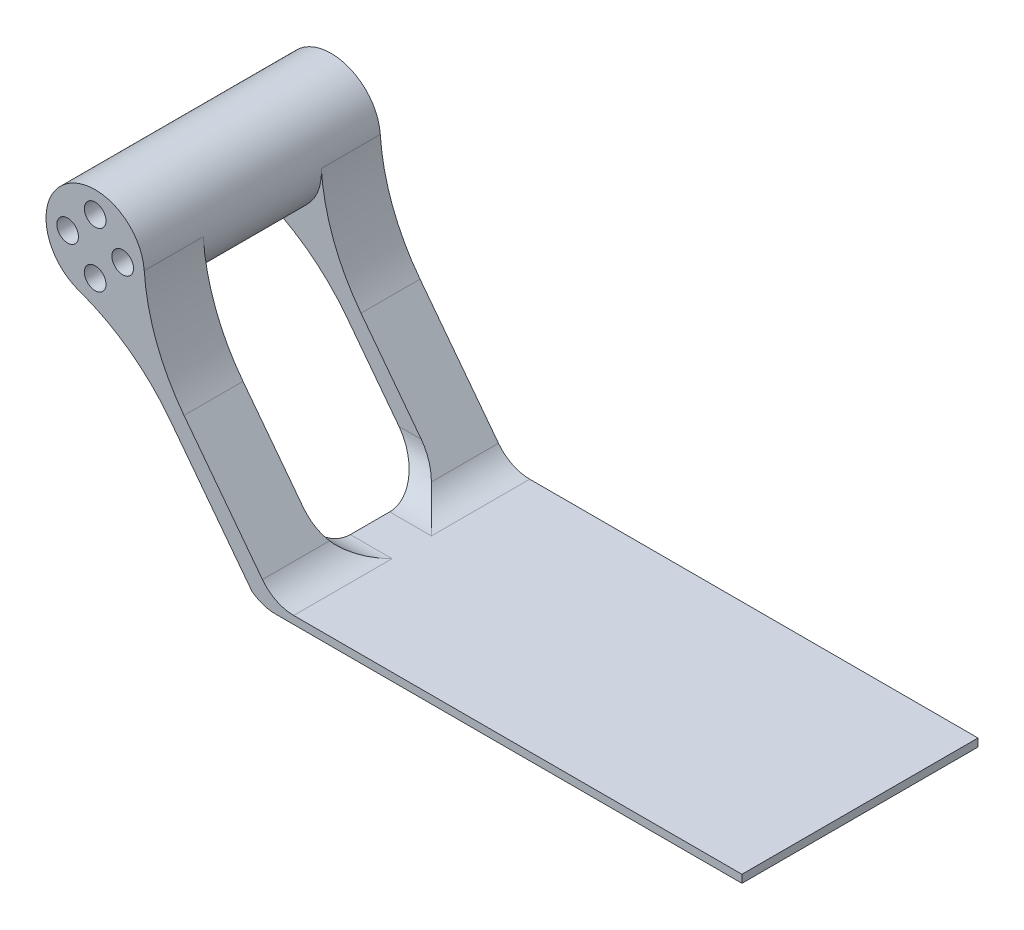
ISO-10303-21;
HEADER;
FILE_DESCRIPTION(('STEP AP214'),'2;1');
FILE_NAME('part.step','',(''),(''),'','','');
FILE_SCHEMA(('AUTOMOTIVE_DESIGN { 1 0 10303 214 1 1 1 1 }'));
ENDSEC;
DATA;
#1=APPLICATION_CONTEXT('core data for automotive mechanical design processes');
#2=APPLICATION_PROTOCOL_DEFINITION('international standard','automotive_design',2000,#1);
#3=PRODUCT_CONTEXT('',#1,'mechanical');
#4=PRODUCT('Part','Part','',(#3));
#5=PRODUCT_RELATED_PRODUCT_CATEGORY('part','',(#4));
#6=PRODUCT_DEFINITION_FORMATION('','',#4);
#7=PRODUCT_DEFINITION_CONTEXT('part definition',#1,'design');
#8=PRODUCT_DEFINITION('design','',#6,#7);
#9=PRODUCT_DEFINITION_SHAPE('','',#8);
#10=(LENGTH_UNIT() NAMED_UNIT(*) SI_UNIT(.MILLI.,.METRE.));
#11=(NAMED_UNIT(*) PLANE_ANGLE_UNIT() SI_UNIT($,.RADIAN.));
#12=(NAMED_UNIT(*) SI_UNIT($,.STERADIAN.) SOLID_ANGLE_UNIT());
#13=UNCERTAINTY_MEASURE_WITH_UNIT(LENGTH_MEASURE(1.E-05),#10,'distance_accuracy_value','');
#14=(GEOMETRIC_REPRESENTATION_CONTEXT(3) GLOBAL_UNCERTAINTY_ASSIGNED_CONTEXT((#13)) GLOBAL_UNIT_ASSIGNED_CONTEXT((#10,
#11,#12)) REPRESENTATION_CONTEXT('',''));
#15=CARTESIAN_POINT('',(0.,0.,0.));
#16=DIRECTION('',(0.,0.,1.));
#17=DIRECTION('',(1.,0.,0.));
#18=AXIS2_PLACEMENT_3D('',#15,#16,#17);
#19=CARTESIAN_POINT('',(0.,0.,-19.));
#20=DIRECTION('',(0.,0.,-1.));
#21=DIRECTION('',(1.,0.,0.));
#22=AXIS2_PLACEMENT_3D('',#19,#20,#21);
#23=PLANE('',#22);
#24=CARTESIAN_POINT('',(-110.53749201089,58.0105942458387,-19.));
#25=DIRECTION('',(0.,0.,1.));
#26=DIRECTION('',(1.,0.,0.));
#27=AXIS2_PLACEMENT_3D('',#24,#25,#26);
#28=CIRCLE('',#27,12.5);
#29=CARTESIAN_POINT('',(-114.691586328743,46.2210437710164,-19.));
#30=VERTEX_POINT('',#29);
#31=CARTESIAN_POINT('',(-98.0684013190819,58.8891028226064,-19.));
#32=VERTEX_POINT('',#31);
#33=EDGE_CURVE('E253',#30,#32,#28,.T.);
#34=ORIENTED_EDGE('',*,*,#33,.F.);
#35=CARTESIAN_POINT('',(-131.307963600154,-0.937158128272934,-19.));
#36=DIRECTION('',(0.,0.,-1.));
#37=DIRECTION('',(-1.,0.,0.));
#38=AXIS2_PLACEMENT_3D('',#35,#36,#37);
#39=CIRCLE('',#38,50.);
#40=CARTESIAN_POINT('',(-91.539578409577,29.3692032391673,-19.));
#41=VERTEX_POINT('',#40);
#42=EDGE_CURVE('E280',#30,#41,#39,.T.);
#43=ORIENTED_EDGE('',*,*,#42,.T.);
#44=DIRECTION('',(-0.606127227348806,0.795367703811545,0.));
#45=VECTOR('',#44,1.);
#46=CARTESIAN_POINT('',(-43.750115665387,-33.340725525277,-19.));
#47=LINE('',#46,#45);
#48=CARTESIAN_POINT('',(-78.3029999689858,12.,-19.));
#49=VERTEX_POINT('',#48);
#50=EDGE_CURVE('E360',#49,#41,#47,.T.);
#51=ORIENTED_EDGE('',*,*,#50,.F.);
#52=DIRECTION('',(-1.,0.,0.));
#53=VECTOR('',#52,1.);
#54=CARTESIAN_POINT('',(-65.0245223254047,12.,-19.));
#55=LINE('',#54,#53);
#56=CARTESIAN_POINT('',(-72.6452394408236,12.,-19.));
#57=VERTEX_POINT('',#56);
#58=EDGE_CURVE('E235',#49,#57,#55,.F.);
#59=ORIENTED_EDGE('',*,*,#58,.T.);
#60=DIRECTION('',(0.606127227348806,-0.795367703811545,0.));
#61=VECTOR('',#60,1.);
#62=CARTESIAN_POINT('',(-40.170960998235,-30.6131530022074,-19.));
#63=LINE('',#62,#61);
#64=CARTESIAN_POINT('',(-87.9604237424251,32.0967757622371,-19.));
#65=VERTEX_POINT('',#64);
#66=EDGE_CURVE('E362',#65,#57,#63,.T.);
#67=ORIENTED_EDGE('',*,*,#66,.F.);
#68=CARTESIAN_POINT('',(-48.1920385518479,62.4031371296773,-19.));
#69=DIRECTION('',(0.,0.,-1.));
#70=DIRECTION('',(-1.,0.,0.));
#71=AXIS2_PLACEMENT_3D('',#68,#69,#70);
#72=CIRCLE('',#71,50.);
#73=EDGE_CURVE('E284',#65,#32,#72,.T.);
#74=ORIENTED_EDGE('',*,*,#73,.T.);
#75=EDGE_LOOP('',(#34,#43,#51,#59,#67,#74));
#76=FACE_BOUND('',#75,.T.);
#77=ADVANCED_FACE('F40',(#76),#23,.F.);
#78=CARTESIAN_POINT('',(0.,0.,11.));
#79=DIRECTION('',(0.,0.,1.));
#80=DIRECTION('',(1.,0.,0.));
#81=AXIS2_PLACEMENT_3D('',#78,#79,#80);
#82=PLANE('',#81);
#83=CARTESIAN_POINT('',(-110.53749201089,58.0105942458387,11.));
#84=DIRECTION('',(0.,0.,-1.));
#85=DIRECTION('',(-1.,0.,0.));
#86=AXIS2_PLACEMENT_3D('',#83,#84,#85);
#87=CIRCLE('',#86,12.5);
#88=CARTESIAN_POINT('',(-98.0684013190819,58.8891028226064,11.));
#89=VERTEX_POINT('',#88);
#90=CARTESIAN_POINT('',(-114.691586328743,46.2210437710164,11.));
#91=VERTEX_POINT('',#90);
#92=EDGE_CURVE('E230',#89,#91,#87,.T.);
#93=ORIENTED_EDGE('',*,*,#92,.F.);
#94=CARTESIAN_POINT('',(-48.1920385518479,62.4031371296773,11.));
#95=DIRECTION('',(0.,0.,1.));
#96=DIRECTION('',(1.,0.,0.));
#97=AXIS2_PLACEMENT_3D('',#94,#95,#96);
#98=CIRCLE('',#97,50.);
#99=CARTESIAN_POINT('',(-87.9604237424251,32.0967757622371,11.));
#100=VERTEX_POINT('',#99);
#101=EDGE_CURVE('E11',#89,#100,#98,.T.);
#102=ORIENTED_EDGE('',*,*,#101,.T.);
#103=DIRECTION('',(0.606127227348806,-0.795367703811545,0.));
#104=VECTOR('',#103,1.);
#105=CARTESIAN_POINT('',(-40.170960998235,-30.6131530022074,11.));
#106=LINE('',#105,#104);
#107=CARTESIAN_POINT('',(-72.6452394408236,12.,11.));
#108=VERTEX_POINT('',#107);
#109=EDGE_CURVE('E295',#100,#108,#106,.T.);
#110=ORIENTED_EDGE('',*,*,#109,.T.);
#111=DIRECTION('',(-1.,0.,0.));
#112=VECTOR('',#111,1.);
#113=CARTESIAN_POINT('',(-70.682282853567,12.,11.));
#114=LINE('',#113,#112);
#115=CARTESIAN_POINT('',(-78.3029999689858,12.,11.));
#116=VERTEX_POINT('',#115);
#117=EDGE_CURVE('E209',#108,#116,#114,.T.);
#118=ORIENTED_EDGE('',*,*,#117,.T.);
#119=DIRECTION('',(-0.606127227348806,0.795367703811545,0.));
#120=VECTOR('',#119,1.);
#121=CARTESIAN_POINT('',(-43.750115665387,-33.340725525277,11.));
#122=LINE('',#121,#120);
#123=CARTESIAN_POINT('',(-91.539578409577,29.3692032391673,11.));
#124=VERTEX_POINT('',#123);
#125=EDGE_CURVE('E182',#116,#124,#122,.T.);
#126=ORIENTED_EDGE('',*,*,#125,.T.);
#127=CARTESIAN_POINT('',(-131.307963600154,-0.937158128272934,11.));
#128=DIRECTION('',(0.,0.,1.));
#129=DIRECTION('',(1.,0.,0.));
#130=AXIS2_PLACEMENT_3D('',#127,#128,#129);
#131=CIRCLE('',#130,50.);
#132=EDGE_CURVE('E275',#124,#91,#131,.T.);
#133=ORIENTED_EDGE('',*,*,#132,.T.);
#134=EDGE_LOOP('',(#93,#102,#110,#118,#126,#133));
#135=FACE_BOUND('',#134,.T.);
#136=ADVANCED_FACE('F356',(#135),#82,.F.);
#137=CARTESIAN_POINT('',(0.,2.,0.));
#138=DIRECTION('',(0.,-1.,0.));
#139=DIRECTION('',(0.,0.,-1.));
#140=AXIS2_PLACEMENT_3D('',#137,#138,#139);
#141=PLANE('',#140);
#142=DIRECTION('',(0.,0.,-1.));
#143=VECTOR('',#142,1.);
#144=CARTESIAN_POINT('',(-60.0724382671297,2.,0.));
#145=LINE('',#144,#143);
#146=CARTESIAN_POINT('',(-60.0724382671297,2.,-34.));
#147=VERTEX_POINT('',#146);
#148=CARTESIAN_POINT('',(-60.0724382671297,2.,-9.00000000000002));
#149=VERTEX_POINT('',#148);
#150=EDGE_CURVE('E225',#147,#149,#145,.F.);
#151=ORIENTED_EDGE('',*,*,#150,.T.);
#152=DIRECTION('',(-1.,0.,0.));
#153=VECTOR('',#152,1.);
#154=CARTESIAN_POINT('',(-70.682282853567,2.,-9.00000000000002));
#155=LINE('',#154,#153);
#156=CARTESIAN_POINT('',(-70.682282853567,2.,-9.00000000000002));
#157=VERTEX_POINT('',#156);
#158=EDGE_CURVE('E232',#149,#157,#155,.T.);
#159=ORIENTED_EDGE('',*,*,#158,.T.);
#160=DIRECTION('',(0.,0.,1.));
#161=VECTOR('',#160,1.);
#162=CARTESIAN_POINT('',(-70.682282853567,2.,8.52060075093872));
#163=LINE('',#162,#161);
#164=CARTESIAN_POINT('',(-70.682282853567,2.,0.999999999999989));
#165=VERTEX_POINT('',#164);
#166=EDGE_CURVE('E319',#157,#165,#163,.T.);
#167=ORIENTED_EDGE('',*,*,#166,.T.);
#168=DIRECTION('',(-1.,0.,0.));
#169=VECTOR('',#168,1.);
#170=CARTESIAN_POINT('',(-65.0245223254047,2.,0.999999999999989));
#171=LINE('',#170,#169);
#172=CARTESIAN_POINT('',(-60.0724382671297,2.,0.999999999999989));
#173=VERTEX_POINT('',#172);
#174=EDGE_CURVE('E214',#165,#173,#171,.F.);
#175=ORIENTED_EDGE('',*,*,#174,.T.);
#176=DIRECTION('',(0.,0.,1.));
#177=VECTOR('',#176,1.);
#178=CARTESIAN_POINT('',(-60.0724382671297,2.,26.));
#179=LINE('',#178,#177);
#180=CARTESIAN_POINT('',(-60.0724382671297,2.,26.));
#181=VERTEX_POINT('',#180);
#182=EDGE_CURVE('E212',#173,#181,#179,.T.);
#183=ORIENTED_EDGE('',*,*,#182,.T.);
#184=DIRECTION('',(1.,0.,0.));
#185=VECTOR('',#184,1.);
#186=CARTESIAN_POINT('',(53.8677171464331,2.,26.));
#187=LINE('',#186,#185);
#188=CARTESIAN_POINT('',(53.8677171464331,2.,26.));
#189=VERTEX_POINT('',#188);
#190=EDGE_CURVE('E318',#181,#189,#187,.T.);
#191=ORIENTED_EDGE('',*,*,#190,.T.);
#192=DIRECTION('',(0.,0.,-1.));
#193=VECTOR('',#192,1.);
#194=CARTESIAN_POINT('',(53.867717146433,2.,-34.));
#195=LINE('',#194,#193);
#196=CARTESIAN_POINT('',(53.867717146433,2.,-34.));
#197=VERTEX_POINT('',#196);
#198=EDGE_CURVE('E321',#189,#197,#195,.T.);
#199=ORIENTED_EDGE('',*,*,#198,.T.);
#200=DIRECTION('',(-1.,0.,0.));
#201=VECTOR('',#200,1.);
#202=CARTESIAN_POINT('',(-70.6822828535669,2.,-34.));
#203=LINE('',#202,#201);
#204=EDGE_CURVE('E323',#197,#147,#203,.T.);
#205=ORIENTED_EDGE('',*,*,#204,.T.);
#206=EDGE_LOOP('',(#151,#159,#167,#175,#183,#191,#199,#205));
#207=FACE_BOUND('',#206,.T.);
#208=ADVANCED_FACE('F346',(#207),#141,.F.);
#209=CARTESIAN_POINT('',(53.8677171464331,2.,26.));
#210=DIRECTION('',(0.,0.,-1.));
#211=DIRECTION('',(-1.,0.,0.));
#212=AXIS2_PLACEMENT_3D('',#209,#210,#211);
#213=PLANE('',#212);
#214=ORIENTED_EDGE('',*,*,#190,.F.);
#215=CARTESIAN_POINT('',(-60.0724382671297,12.,26.));
#216=DIRECTION('',(0.,0.,-1.));
#217=DIRECTION('',(-1.,0.,0.));
#218=AXIS2_PLACEMENT_3D('',#215,#216,#217);
#219=CIRCLE('',#218,10.);
#220=CARTESIAN_POINT('',(-68.0261153052451,5.93872772651194,26.));
#221=VERTEX_POINT('',#220);
#222=EDGE_CURVE('E222',#181,#221,#219,.T.);
#223=ORIENTED_EDGE('',*,*,#222,.T.);
#224=DIRECTION('',(0.606127227348806,-0.795367703811545,0.));
#225=VECTOR('',#224,1.);
#226=CARTESIAN_POINT('',(-40.170960998235,-30.6131530022074,26.));
#227=LINE('',#226,#225);
#228=CARTESIAN_POINT('',(-87.9604237424251,32.0967757622371,26.));
#229=VERTEX_POINT('',#228);
#230=EDGE_CURVE('E229',#229,#221,#227,.T.);
#231=ORIENTED_EDGE('',*,*,#230,.F.);
#232=CARTESIAN_POINT('',(-48.1920385518479,62.4031371296773,26.));
#233=DIRECTION('',(0.,0.,-1.));
#234=DIRECTION('',(-1.,0.,0.));
#235=AXIS2_PLACEMENT_3D('',#232,#233,#234);
#236=CIRCLE('',#235,50.);
#237=CARTESIAN_POINT('',(-98.0684013190819,58.8891028226064,26.));
#238=VERTEX_POINT('',#237);
#239=EDGE_CURVE('E48',#229,#238,#236,.T.);
#240=ORIENTED_EDGE('',*,*,#239,.T.);
#241=CARTESIAN_POINT('',(-110.53749201089,58.0105942458387,26.));
#242=DIRECTION('',(0.,0.,1.));
#243=DIRECTION('',(1.,0.,0.));
#244=AXIS2_PLACEMENT_3D('',#241,#242,#243);
#245=CIRCLE('',#244,12.5);
#246=CARTESIAN_POINT('',(-114.691586328743,46.2210437710164,26.));
#247=VERTEX_POINT('',#246);
#248=EDGE_CURVE('E193',#238,#247,#245,.T.);
#249=ORIENTED_EDGE('',*,*,#248,.T.);
#250=CARTESIAN_POINT('',(-131.307963600154,-0.937158128272934,26.));
#251=DIRECTION('',(0.,0.,-1.));
#252=DIRECTION('',(-1.,0.,0.));
#253=AXIS2_PLACEMENT_3D('',#250,#251,#252);
#254=CIRCLE('',#253,50.);
#255=CARTESIAN_POINT('',(-91.539578409577,29.3692032391673,26.));
#256=VERTEX_POINT('',#255);
#257=EDGE_CURVE('E191',#247,#256,#254,.T.);
#258=ORIENTED_EDGE('',*,*,#257,.T.);
#259=DIRECTION('',(-0.606127227348806,0.795367703811545,0.));
#260=VECTOR('',#259,1.);
#261=CARTESIAN_POINT('',(-43.750115665387,-33.340725525277,26.));
#262=LINE('',#261,#260);
#263=CARTESIAN_POINT('',(-70.682282853567,1.99999999999998,26.));
#264=VERTEX_POINT('',#263);
#265=EDGE_CURVE('E173',#264,#256,#262,.T.);
#266=ORIENTED_EDGE('',*,*,#265,.F.);
#267=CARTESIAN_POINT('',(-64.682282853567,10.,26.));
#268=DIRECTION('',(0.,0.,-1.));
#269=DIRECTION('',(-1.,0.,0.));
#270=AXIS2_PLACEMENT_3D('',#267,#268,#269);
#271=CIRCLE('',#270,10.);
#272=CARTESIAN_POINT('',(-64.682282853567,0.,26.));
#273=VERTEX_POINT('',#272);
#274=EDGE_CURVE('E188',#264,#273,#271,.F.);
#275=ORIENTED_EDGE('',*,*,#274,.T.);
#276=DIRECTION('',(1.,0.,0.));
#277=VECTOR('',#276,1.);
#278=CARTESIAN_POINT('',(53.8677171464331,0.,26.));
#279=LINE('',#278,#277);
#280=CARTESIAN_POINT('',(53.8677171464331,0.,26.));
#281=VERTEX_POINT('',#280);
#282=EDGE_CURVE('E181',#273,#281,#279,.T.);
#283=ORIENTED_EDGE('',*,*,#282,.T.);
#284=DIRECTION('',(0.,-1.,0.));
#285=VECTOR('',#284,1.);
#286=CARTESIAN_POINT('',(53.8677171464331,2.,26.));
#287=LINE('',#286,#285);
#288=EDGE_CURVE('E199',#189,#281,#287,.T.);
#289=ORIENTED_EDGE('',*,*,#288,.F.);
#290=EDGE_LOOP('',(#214,#223,#231,#240,#249,#258,#266,#275,#283,#289));
#291=FACE_BOUND('',#290,.T.);
#292=CARTESIAN_POINT('',(-117.53749201089,58.0105942458386,26.));
#293=DIRECTION('',(0.,0.,1.));
#294=DIRECTION('',(1.,0.,0.));
#295=AXIS2_PLACEMENT_3D('',#292,#293,#294);
#296=CIRCLE('',#295,2.74999999999996);
#297=CARTESIAN_POINT('',(-114.78749201089,58.0105942458386,26.));
#298=VERTEX_POINT('',#297);
#299=EDGE_CURVE('E192',#298,#298,#296,.T.);
#300=ORIENTED_EDGE('',*,*,#299,.F.);
#301=EDGE_LOOP('',(#300));
#302=FACE_BOUND('',#301,.T.);
#303=CARTESIAN_POINT('',(-110.53749201089,51.0105942458387,26.));
#304=DIRECTION('',(0.,0.,1.));
#305=DIRECTION('',(1.,0.,0.));
#306=AXIS2_PLACEMENT_3D('',#303,#304,#305);
#307=CIRCLE('',#306,2.75000000000002);
#308=CARTESIAN_POINT('',(-107.78749201089,51.0105942458387,26.));
#309=VERTEX_POINT('',#308);
#310=EDGE_CURVE('E311',#309,#309,#307,.T.);
#311=ORIENTED_EDGE('',*,*,#310,.F.);
#312=EDGE_LOOP('',(#311));
#313=FACE_BOUND('',#312,.T.);
#314=CARTESIAN_POINT('',(-103.53749201089,58.0105942458388,26.));
#315=DIRECTION('',(0.,0.,1.));
#316=DIRECTION('',(1.,0.,0.));
#317=AXIS2_PLACEMENT_3D('',#314,#315,#316);
#318=CIRCLE('',#317,2.75000000000001);
#319=CARTESIAN_POINT('',(-100.78749201089,58.0105942458388,26.));
#320=VERTEX_POINT('',#319);
#321=EDGE_CURVE('E303',#320,#320,#318,.T.);
#322=ORIENTED_EDGE('',*,*,#321,.F.);
#323=EDGE_LOOP('',(#322));
#324=FACE_BOUND('',#323,.T.);
#325=CARTESIAN_POINT('',(-110.53749201089,65.0105942458387,26.));
#326=DIRECTION('',(0.,0.,1.));
#327=DIRECTION('',(1.,0.,0.));
#328=AXIS2_PLACEMENT_3D('',#325,#326,#327);
#329=CIRCLE('',#328,2.75);
#330=CARTESIAN_POINT('',(-107.78749201089,65.0105942458387,26.));
#331=VERTEX_POINT('',#330);
#332=EDGE_CURVE('E298',#331,#331,#329,.T.);
#333=ORIENTED_EDGE('',*,*,#332,.F.);
#334=EDGE_LOOP('',(#333));
#335=FACE_BOUND('',#334,.T.);
#336=ADVANCED_FACE('F186',(#291,#302,#313,#324,#335),#213,.F.);
#337=CARTESIAN_POINT('',(53.867717146433,2.,-34.));
#338=DIRECTION('',(-1.,0.,0.));
#339=DIRECTION('',(0.,0.,1.));
#340=AXIS2_PLACEMENT_3D('',#337,#338,#339);
#341=PLANE('',#340);
#342=DIRECTION('',(0.,0.,-1.));
#343=VECTOR('',#342,1.);
#344=CARTESIAN_POINT('',(53.867717146433,0.,-34.));
#345=LINE('',#344,#343);
#346=CARTESIAN_POINT('',(53.867717146433,0.,-34.));
#347=VERTEX_POINT('',#346);
#348=EDGE_CURVE('E327',#281,#347,#345,.T.);
#349=ORIENTED_EDGE('',*,*,#348,.T.);
#350=DIRECTION('',(0.,-1.,0.));
#351=VECTOR('',#350,1.);
#352=CARTESIAN_POINT('',(53.867717146433,2.,-34.));
#353=LINE('',#352,#351);
#354=EDGE_CURVE('E204',#197,#347,#353,.T.);
#355=ORIENTED_EDGE('',*,*,#354,.F.);
#356=ORIENTED_EDGE('',*,*,#198,.F.);
#357=ORIENTED_EDGE('',*,*,#288,.T.);
#358=EDGE_LOOP('',(#349,#355,#356,#357));
#359=FACE_BOUND('',#358,.T.);
#360=ADVANCED_FACE('F344',(#359),#341,.F.);
#361=CARTESIAN_POINT('',(-70.6822828535669,2.,-34.));
#362=DIRECTION('',(0.,0.,1.));
#363=DIRECTION('',(1.,0.,0.));
#364=AXIS2_PLACEMENT_3D('',#361,#362,#363);
#365=PLANE('',#364);
#366=DIRECTION('',(-1.,0.,0.));
#367=VECTOR('',#366,1.);
#368=CARTESIAN_POINT('',(-70.6822828535669,0.,-34.));
#369=LINE('',#368,#367);
#370=CARTESIAN_POINT('',(-64.6822828535669,0.,-34.));
#371=VERTEX_POINT('',#370);
#372=EDGE_CURVE('E329',#347,#371,#369,.T.);
#373=ORIENTED_EDGE('',*,*,#372,.T.);
#374=CARTESIAN_POINT('',(-64.6822828535669,10.,-34.));
#375=DIRECTION('',(0.,0.,1.));
#376=DIRECTION('',(1.,0.,0.));
#377=AXIS2_PLACEMENT_3D('',#374,#375,#376);
#378=CIRCLE('',#377,10.);
#379=CARTESIAN_POINT('',(-70.6822828535669,2.,-34.));
#380=VERTEX_POINT('',#379);
#381=EDGE_CURVE('E201',#371,#380,#378,.F.);
#382=ORIENTED_EDGE('',*,*,#381,.T.);
#383=DIRECTION('',(-0.606127227348806,0.795367703811545,0.));
#384=VECTOR('',#383,1.);
#385=CARTESIAN_POINT('',(-43.750115665387,-33.340725525277,-34.));
#386=LINE('',#385,#384);
#387=CARTESIAN_POINT('',(-91.539578409577,29.3692032391673,-34.));
#388=VERTEX_POINT('',#387);
#389=EDGE_CURVE('E372',#380,#388,#386,.T.);
#390=ORIENTED_EDGE('',*,*,#389,.T.);
#391=CARTESIAN_POINT('',(-131.307963600154,-0.937158128272934,-34.));
#392=DIRECTION('',(0.,0.,1.));
#393=DIRECTION('',(1.,0.,0.));
#394=AXIS2_PLACEMENT_3D('',#391,#392,#393);
#395=CIRCLE('',#394,50.);
#396=CARTESIAN_POINT('',(-114.691586328743,46.2210437710164,-34.));
#397=VERTEX_POINT('',#396);
#398=EDGE_CURVE('E278',#388,#397,#395,.T.);
#399=ORIENTED_EDGE('',*,*,#398,.T.);
#400=CARTESIAN_POINT('',(-110.53749201089,58.0105942458387,-34.));
#401=DIRECTION('',(0.,0.,1.));
#402=DIRECTION('',(1.,0.,0.));
#403=AXIS2_PLACEMENT_3D('',#400,#401,#402);
#404=CIRCLE('',#403,12.5);
#405=CARTESIAN_POINT('',(-98.0684013190819,58.8891028226064,-34.));
#406=VERTEX_POINT('',#405);
#407=EDGE_CURVE('E375',#406,#397,#404,.T.);
#408=ORIENTED_EDGE('',*,*,#407,.F.);
#409=CARTESIAN_POINT('',(-48.1920385518479,62.4031371296773,-34.));
#410=DIRECTION('',(0.,0.,1.));
#411=DIRECTION('',(1.,0.,0.));
#412=AXIS2_PLACEMENT_3D('',#409,#410,#411);
#413=CIRCLE('',#412,50.);
#414=CARTESIAN_POINT('',(-87.9604237424251,32.0967757622371,-34.));
#415=VERTEX_POINT('',#414);
#416=EDGE_CURVE('E282',#406,#415,#413,.T.);
#417=ORIENTED_EDGE('',*,*,#416,.T.);
#418=DIRECTION('',(0.606127227348806,-0.795367703811545,0.));
#419=VECTOR('',#418,1.);
#420=CARTESIAN_POINT('',(-40.170960998235,-30.6131530022074,-34.));
#421=LINE('',#420,#419);
#422=CARTESIAN_POINT('',(-68.0261153052451,5.93872772651194,-34.));
#423=VERTEX_POINT('',#422);
#424=EDGE_CURVE('E252',#415,#423,#421,.T.);
#425=ORIENTED_EDGE('',*,*,#424,.T.);
#426=CARTESIAN_POINT('',(-60.0724382671297,12.,-34.));
#427=DIRECTION('',(0.,0.,1.));
#428=DIRECTION('',(1.,0.,0.));
#429=AXIS2_PLACEMENT_3D('',#426,#427,#428);
#430=CIRCLE('',#429,10.);
#431=EDGE_CURVE('E246',#423,#147,#430,.T.);
#432=ORIENTED_EDGE('',*,*,#431,.T.);
#433=ORIENTED_EDGE('',*,*,#204,.F.);
#434=ORIENTED_EDGE('',*,*,#354,.T.);
#435=EDGE_LOOP('',(#373,#382,#390,#399,#408,#417,#425,#432,#433,#434));
#436=FACE_BOUND('',#435,.T.);
#437=CARTESIAN_POINT('',(-117.53749201089,58.0105942458386,-34.));
#438=DIRECTION('',(0.,0.,1.));
#439=DIRECTION('',(1.,0.,0.));
#440=AXIS2_PLACEMENT_3D('',#437,#438,#439);
#441=CIRCLE('',#440,2.74999999999996);
#442=CARTESIAN_POINT('',(-114.78749201089,58.0105942458386,-34.));
#443=VERTEX_POINT('',#442);
#444=EDGE_CURVE('E378',#443,#443,#441,.T.);
#445=ORIENTED_EDGE('',*,*,#444,.T.);
#446=EDGE_LOOP('',(#445));
#447=FACE_BOUND('',#446,.T.);
#448=CARTESIAN_POINT('',(-110.53749201089,51.0105942458387,-34.));
#449=DIRECTION('',(0.,0.,1.));
#450=DIRECTION('',(1.,0.,0.));
#451=AXIS2_PLACEMENT_3D('',#448,#449,#450);
#452=CIRCLE('',#451,2.75000000000002);
#453=CARTESIAN_POINT('',(-107.78749201089,51.0105942458387,-34.));
#454=VERTEX_POINT('',#453);
#455=EDGE_CURVE('E381',#454,#454,#452,.T.);
#456=ORIENTED_EDGE('',*,*,#455,.T.);
#457=EDGE_LOOP('',(#456));
#458=FACE_BOUND('',#457,.T.);
#459=CARTESIAN_POINT('',(-103.53749201089,58.0105942458388,-34.));
#460=DIRECTION('',(0.,0.,1.));
#461=DIRECTION('',(1.,0.,0.));
#462=AXIS2_PLACEMENT_3D('',#459,#460,#461);
#463=CIRCLE('',#462,2.75000000000001);
#464=CARTESIAN_POINT('',(-100.78749201089,58.0105942458388,-34.));
#465=VERTEX_POINT('',#464);
#466=EDGE_CURVE('E384',#465,#465,#463,.T.);
#467=ORIENTED_EDGE('',*,*,#466,.T.);
#468=EDGE_LOOP('',(#467));
#469=FACE_BOUND('',#468,.T.);
#470=CARTESIAN_POINT('',(-110.53749201089,65.0105942458387,-34.));
#471=DIRECTION('',(0.,0.,1.));
#472=DIRECTION('',(1.,0.,0.));
#473=AXIS2_PLACEMENT_3D('',#470,#471,#472);
#474=CIRCLE('',#473,2.75);
#475=CARTESIAN_POINT('',(-107.78749201089,65.0105942458387,-34.));
#476=VERTEX_POINT('',#475);
#477=EDGE_CURVE('E367',#476,#476,#474,.T.);
#478=ORIENTED_EDGE('',*,*,#477,.T.);
#479=EDGE_LOOP('',(#478));
#480=FACE_BOUND('',#479,.T.);
#481=ADVANCED_FACE('F336',(#436,#447,#458,#469,#480),#365,.F.);
#482=CARTESIAN_POINT('',(0.,0.,0.));
#483=DIRECTION('',(0.,-1.,0.));
#484=DIRECTION('',(0.,0.,-1.));
#485=AXIS2_PLACEMENT_3D('',#482,#483,#484);
#486=PLANE('',#485);
#487=ORIENTED_EDGE('',*,*,#282,.F.);
#488=DIRECTION('',(0.,0.,1.));
#489=VECTOR('',#488,1.);
#490=CARTESIAN_POINT('',(-64.6822828535669,0.,-34.));
#491=LINE('',#490,#489);
#492=EDGE_CURVE('E198',#273,#371,#491,.F.);
#493=ORIENTED_EDGE('',*,*,#492,.T.);
#494=ORIENTED_EDGE('',*,*,#372,.F.);
#495=ORIENTED_EDGE('',*,*,#348,.F.);
#496=EDGE_LOOP('',(#487,#493,#494,#495));
#497=FACE_BOUND('',#496,.T.);
#498=ADVANCED_FACE('F342',(#497),#486,.T.);
#499=CARTESIAN_POINT('',(-64.682282853567,10.,-10.08));
#500=DIRECTION('',(0.,0.,-1.));
#501=DIRECTION('',(-1.,0.,0.));
#502=AXIS2_PLACEMENT_3D('',#499,#500,#501);
#503=CYLINDRICAL_SURFACE('',#502,10.);
#504=ORIENTED_EDGE('',*,*,#381,.F.);
#505=ORIENTED_EDGE('',*,*,#492,.F.);
#506=ORIENTED_EDGE('',*,*,#274,.F.);
#507=DIRECTION('',(0.,0.,1.));
#508=VECTOR('',#507,1.);
#509=CARTESIAN_POINT('',(-70.682282853567,1.99999999999998,11.));
#510=LINE('',#509,#508);
#511=EDGE_CURVE('E170',#165,#264,#510,.T.);
#512=ORIENTED_EDGE('',*,*,#511,.F.);
#513=ORIENTED_EDGE('',*,*,#166,.F.);
#514=EDGE_CURVE('E316',#380,#157,#163,.T.);
#515=ORIENTED_EDGE('',*,*,#514,.F.);
#516=EDGE_LOOP('',(#504,#505,#506,#512,#513,#515));
#517=FACE_BOUND('',#516,.T.);
#518=ADVANCED_FACE('F197',(#517),#503,.T.);
#519=CARTESIAN_POINT('',(-40.170960998235,-30.6131530022074,11.));
#520=DIRECTION('',(-0.795367703811545,-0.606127227348806,0.));
#521=DIRECTION('',(0.606127227348806,-0.795367703811545,0.));
#522=AXIS2_PLACEMENT_3D('',#519,#520,#521);
#523=PLANE('',#522);
#524=ORIENTED_EDGE('',*,*,#109,.F.);
#525=DIRECTION('',(0.,0.,1.));
#526=VECTOR('',#525,1.);
#527=CARTESIAN_POINT('',(-87.9604237424251,32.0967757622371,11.));
#528=LINE('',#527,#526);
#529=EDGE_CURVE('E272',#100,#229,#528,.T.);
#530=ORIENTED_EDGE('',*,*,#529,.T.);
#531=ORIENTED_EDGE('',*,*,#230,.T.);
#532=DIRECTION('',(0.,0.,1.));
#533=VECTOR('',#532,1.);
#534=CARTESIAN_POINT('',(-68.0261153052451,5.93872772651194,11.));
#535=LINE('',#534,#533);
#536=CARTESIAN_POINT('',(-68.0261153052451,5.93872772651194,8.95367703811544));
#537=VERTEX_POINT('',#536);
#538=EDGE_CURVE('E216',#221,#537,#535,.F.);
#539=ORIENTED_EDGE('',*,*,#538,.T.);
#540=CARTESIAN_POINT('',(-72.6452394408236,12.,0.999999999999989));
#541=DIRECTION('',(-0.795367703811545,-0.606127227348806,0.));
#542=DIRECTION('',(0.606127227348806,-0.795367703811545,0.));
#543=AXIS2_PLACEMENT_3D('',#540,#541,#542);
#544=ELLIPSE('',#543,12.5728011736939,10.);
#545=EDGE_CURVE('E219',#537,#108,#544,.T.);
#546=ORIENTED_EDGE('',*,*,#545,.T.);
#547=EDGE_LOOP('',(#524,#530,#531,#539,#546));
#548=FACE_BOUND('',#547,.T.);
#549=ADVANCED_FACE('F294',(#548),#523,.F.);
#550=CARTESIAN_POINT('',(-43.750115665387,-33.340725525277,11.));
#551=DIRECTION('',(0.795367703811545,0.606127227348806,0.));
#552=DIRECTION('',(-0.606127227348806,0.795367703811545,0.));
#553=AXIS2_PLACEMENT_3D('',#550,#551,#552);
#554=PLANE('',#553);
#555=ORIENTED_EDGE('',*,*,#265,.T.);
#556=DIRECTION('',(0.,0.,1.));
#557=VECTOR('',#556,1.);
#558=CARTESIAN_POINT('',(-91.539578409577,29.3692032391673,11.));
#559=LINE('',#558,#557);
#560=EDGE_CURVE('E265',#256,#124,#559,.F.);
#561=ORIENTED_EDGE('',*,*,#560,.T.);
#562=ORIENTED_EDGE('',*,*,#125,.F.);
#563=CARTESIAN_POINT('',(-78.3029999689858,12.,0.999999999999989));
#564=DIRECTION('',(0.795367703811545,0.606127227348806,0.));
#565=DIRECTION('',(0.606127227348806,-0.795367703811545,0.));
#566=AXIS2_PLACEMENT_3D('',#563,#564,#565);
#567=ELLIPSE('',#566,12.5728011736939,10.);
#568=EDGE_CURVE('E176',#116,#165,#567,.T.);
#569=ORIENTED_EDGE('',*,*,#568,.T.);
#570=ORIENTED_EDGE('',*,*,#511,.T.);
#571=EDGE_LOOP('',(#555,#561,#562,#569,#570));
#572=FACE_BOUND('',#571,.T.);
#573=ADVANCED_FACE('F172',(#572),#554,.F.);
#574=CARTESIAN_POINT('',(-103.53749201089,58.0105942458388,11.));
#575=DIRECTION('',(0.,0.,1.));
#576=DIRECTION('',(1.,0.,0.));
#577=AXIS2_PLACEMENT_3D('',#574,#575,#576);
#578=CYLINDRICAL_SURFACE('',#577,2.75000000000001);
#579=ORIENTED_EDGE('',*,*,#321,.T.);
#580=EDGE_LOOP('',(#579));
#581=FACE_BOUND('',#580,.T.);
#582=ORIENTED_EDGE('',*,*,#466,.F.);
#583=EDGE_LOOP('',(#582));
#584=FACE_BOUND('',#583,.T.);
#585=ADVANCED_FACE('F472',(#581,#584),#578,.F.);
#586=CARTESIAN_POINT('',(-110.53749201089,51.0105942458387,11.));
#587=DIRECTION('',(0.,0.,1.));
#588=DIRECTION('',(1.,0.,0.));
#589=AXIS2_PLACEMENT_3D('',#586,#587,#588);
#590=CYLINDRICAL_SURFACE('',#589,2.75000000000002);
#591=ORIENTED_EDGE('',*,*,#310,.T.);
#592=EDGE_LOOP('',(#591));
#593=FACE_BOUND('',#592,.T.);
#594=ORIENTED_EDGE('',*,*,#455,.F.);
#595=EDGE_LOOP('',(#594));
#596=FACE_BOUND('',#595,.T.);
#597=ADVANCED_FACE('F475',(#593,#596),#590,.F.);
#598=CARTESIAN_POINT('',(-117.53749201089,58.0105942458386,11.));
#599=DIRECTION('',(0.,0.,1.));
#600=DIRECTION('',(1.,0.,0.));
#601=AXIS2_PLACEMENT_3D('',#598,#599,#600);
#602=CYLINDRICAL_SURFACE('',#601,2.74999999999996);
#603=ORIENTED_EDGE('',*,*,#299,.T.);
#604=EDGE_LOOP('',(#603));
#605=FACE_BOUND('',#604,.T.);
#606=ORIENTED_EDGE('',*,*,#444,.F.);
#607=EDGE_LOOP('',(#606));
#608=FACE_BOUND('',#607,.T.);
#609=ADVANCED_FACE('F399',(#605,#608),#602,.F.);
#610=CARTESIAN_POINT('',(-110.53749201089,58.0105942458387,11.));
#611=DIRECTION('',(0.,0.,1.));
#612=DIRECTION('',(1.,0.,0.));
#613=AXIS2_PLACEMENT_3D('',#610,#611,#612);
#614=CYLINDRICAL_SURFACE('',#613,12.5);
#615=ORIENTED_EDGE('',*,*,#92,.T.);
#616=DIRECTION('',(0.,0.,1.));
#617=VECTOR('',#616,1.);
#618=CARTESIAN_POINT('',(-114.691586328743,46.2210437710164,11.));
#619=LINE('',#618,#617);
#620=EDGE_CURVE('E262',#91,#247,#619,.T.);
#621=ORIENTED_EDGE('',*,*,#620,.T.);
#622=ORIENTED_EDGE('',*,*,#248,.F.);
#623=DIRECTION('',(0.,0.,1.));
#624=VECTOR('',#623,1.);
#625=CARTESIAN_POINT('',(-98.0684013190819,58.8891028226064,11.));
#626=LINE('',#625,#624);
#627=EDGE_CURVE('E248',#238,#89,#626,.F.);
#628=ORIENTED_EDGE('',*,*,#627,.T.);
#629=EDGE_LOOP('',(#615,#621,#622,#628));
#630=FACE_BOUND('',#629,.T.);
#631=ORIENTED_EDGE('',*,*,#407,.T.);
#632=DIRECTION('',(0.,0.,1.));
#633=VECTOR('',#632,1.);
#634=CARTESIAN_POINT('',(-114.691586328743,46.2210437710164,11.));
#635=LINE('',#634,#633);
#636=EDGE_CURVE('E259',#397,#30,#635,.T.);
#637=ORIENTED_EDGE('',*,*,#636,.T.);
#638=ORIENTED_EDGE('',*,*,#33,.T.);
#639=DIRECTION('',(0.,0.,1.));
#640=VECTOR('',#639,1.);
#641=CARTESIAN_POINT('',(-98.0684013190819,58.8891028226064,11.));
#642=LINE('',#641,#640);
#643=EDGE_CURVE('E256',#32,#406,#642,.F.);
#644=ORIENTED_EDGE('',*,*,#643,.T.);
#645=EDGE_LOOP('',(#631,#637,#638,#644));
#646=FACE_BOUND('',#645,.T.);
#647=ADVANCED_FACE('F289',(#630,#646),#614,.T.);
#648=CARTESIAN_POINT('',(-110.53749201089,65.0105942458387,11.));
#649=DIRECTION('',(0.,0.,1.));
#650=DIRECTION('',(1.,0.,0.));
#651=AXIS2_PLACEMENT_3D('',#648,#649,#650);
#652=CYLINDRICAL_SURFACE('',#651,2.75);
#653=ORIENTED_EDGE('',*,*,#332,.T.);
#654=EDGE_LOOP('',(#653));
#655=FACE_BOUND('',#654,.T.);
#656=ORIENTED_EDGE('',*,*,#477,.F.);
#657=EDGE_LOOP('',(#656));
#658=FACE_BOUND('',#657,.T.);
#659=ADVANCED_FACE('F390',(#655,#658),#652,.F.);
#660=CARTESIAN_POINT('',(-60.0724382671297,12.,0.));
#661=DIRECTION('',(0.,0.,-1.));
#662=DIRECTION('',(-1.,0.,0.));
#663=AXIS2_PLACEMENT_3D('',#660,#661,#662);
#664=CYLINDRICAL_SURFACE('',#663,10.);
#665=ORIENTED_EDGE('',*,*,#222,.F.);
#666=ORIENTED_EDGE('',*,*,#182,.F.);
#667=CARTESIAN_POINT('',(-60.0724382671297,12.,0.999999999999989));
#668=DIRECTION('',(-0.707106781186547,0.,-0.707106781186547));
#669=DIRECTION('',(0.707106781186547,0.,-0.707106781186547));
#670=AXIS2_PLACEMENT_3D('',#667,#668,#669);
#671=ELLIPSE('',#670,14.1421356237309,10.);
#672=EDGE_CURVE('E226',#537,#173,#671,.F.);
#673=ORIENTED_EDGE('',*,*,#672,.F.);
#674=ORIENTED_EDGE('',*,*,#538,.F.);
#675=EDGE_LOOP('',(#665,#666,#673,#674));
#676=FACE_BOUND('',#675,.T.);
#677=ADVANCED_FACE('F352',(#676),#664,.F.);
#678=CARTESIAN_POINT('',(0.,12.,0.999999999999989));
#679=DIRECTION('',(1.,0.,0.));
#680=DIRECTION('',(0.,0.,-1.));
#681=AXIS2_PLACEMENT_3D('',#678,#679,#680);
#682=CYLINDRICAL_SURFACE('',#681,10.);
#683=ORIENTED_EDGE('',*,*,#672,.T.);
#684=ORIENTED_EDGE('',*,*,#174,.F.);
#685=ORIENTED_EDGE('',*,*,#568,.F.);
#686=ORIENTED_EDGE('',*,*,#117,.F.);
#687=ORIENTED_EDGE('',*,*,#545,.F.);
#688=EDGE_LOOP('',(#683,#684,#685,#686,#687));
#689=FACE_BOUND('',#688,.T.);
#690=ADVANCED_FACE('F355',(#689),#682,.F.);
#691=CARTESIAN_POINT('',(-40.170960998235,-30.6131530022074,-19.));
#692=DIRECTION('',(0.795367703811545,0.606127227348806,0.));
#693=DIRECTION('',(-0.606127227348806,0.795367703811545,0.));
#694=AXIS2_PLACEMENT_3D('',#691,#692,#693);
#695=PLANE('',#694);
#696=ORIENTED_EDGE('',*,*,#424,.F.);
#697=DIRECTION('',(0.,0.,-1.));
#698=VECTOR('',#697,1.);
#699=CARTESIAN_POINT('',(-87.9604237424251,32.0967757622371,-19.));
#700=LINE('',#699,#698);
#701=EDGE_CURVE('E270',#415,#65,#700,.F.);
#702=ORIENTED_EDGE('',*,*,#701,.T.);
#703=ORIENTED_EDGE('',*,*,#66,.T.);
#704=CARTESIAN_POINT('',(-72.6452394408236,12.,-9.00000000000002));
#705=DIRECTION('',(0.795367703811545,0.606127227348806,0.));
#706=DIRECTION('',(0.606127227348806,-0.795367703811545,0.));
#707=AXIS2_PLACEMENT_3D('',#704,#705,#706);
#708=ELLIPSE('',#707,12.5728011736939,10.);
#709=CARTESIAN_POINT('',(-68.0261153052451,5.93872772651194,-16.9536770381155));
#710=VERTEX_POINT('',#709);
#711=EDGE_CURVE('E243',#57,#710,#708,.F.);
#712=ORIENTED_EDGE('',*,*,#711,.T.);
#713=DIRECTION('',(0.,0.,-1.));
#714=VECTOR('',#713,1.);
#715=CARTESIAN_POINT('',(-68.0261153052451,5.93872772651194,-19.));
#716=LINE('',#715,#714);
#717=EDGE_CURVE('E238',#710,#423,#716,.T.);
#718=ORIENTED_EDGE('',*,*,#717,.T.);
#719=EDGE_LOOP('',(#696,#702,#703,#712,#718));
#720=FACE_BOUND('',#719,.T.);
#721=ADVANCED_FACE('F414',(#720),#695,.T.);
#722=CARTESIAN_POINT('',(-43.750115665387,-33.340725525277,-19.));
#723=DIRECTION('',(-0.795367703811545,-0.606127227348806,0.));
#724=DIRECTION('',(0.606127227348806,-0.795367703811545,0.));
#725=AXIS2_PLACEMENT_3D('',#722,#723,#724);
#726=PLANE('',#725);
#727=ORIENTED_EDGE('',*,*,#50,.T.);
#728=DIRECTION('',(0.,0.,-1.));
#729=VECTOR('',#728,1.);
#730=CARTESIAN_POINT('',(-91.539578409577,29.3692032391673,-34.));
#731=LINE('',#730,#729);
#732=EDGE_CURVE('E267',#41,#388,#731,.T.);
#733=ORIENTED_EDGE('',*,*,#732,.T.);
#734=ORIENTED_EDGE('',*,*,#389,.F.);
#735=ORIENTED_EDGE('',*,*,#514,.T.);
#736=CARTESIAN_POINT('',(-78.3029999689858,12.,-9.00000000000002));
#737=DIRECTION('',(-0.795367703811545,-0.606127227348806,0.));
#738=DIRECTION('',(0.606127227348806,-0.795367703811545,0.));
#739=AXIS2_PLACEMENT_3D('',#736,#737,#738);
#740=ELLIPSE('',#739,12.5728011736939,10.);
#741=EDGE_CURVE('E241',#157,#49,#740,.F.);
#742=ORIENTED_EDGE('',*,*,#741,.T.);
#743=EDGE_LOOP('',(#727,#733,#734,#735,#742));
#744=FACE_BOUND('',#743,.T.);
#745=ADVANCED_FACE('F410',(#744),#726,.T.);
#746=CARTESIAN_POINT('',(-60.0724382671297,12.,-19.));
#747=DIRECTION('',(0.,0.,-1.));
#748=DIRECTION('',(-1.,0.,0.));
#749=AXIS2_PLACEMENT_3D('',#746,#747,#748);
#750=CYLINDRICAL_SURFACE('',#749,10.);
#751=ORIENTED_EDGE('',*,*,#717,.F.);
#752=CARTESIAN_POINT('',(-60.0724382671297,12.,-9.00000000000002));
#753=DIRECTION('',(0.707106781186547,0.,-0.707106781186547));
#754=DIRECTION('',(-0.707106781186547,0.,-0.707106781186547));
#755=AXIS2_PLACEMENT_3D('',#752,#753,#754);
#756=ELLIPSE('',#755,14.1421356237309,10.);
#757=EDGE_CURVE('E249',#149,#710,#756,.T.);
#758=ORIENTED_EDGE('',*,*,#757,.F.);
#759=ORIENTED_EDGE('',*,*,#150,.F.);
#760=ORIENTED_EDGE('',*,*,#431,.F.);
#761=EDGE_LOOP('',(#751,#758,#759,#760));
#762=FACE_BOUND('',#761,.T.);
#763=ADVANCED_FACE('F413',(#762),#750,.F.);
#764=CARTESIAN_POINT('',(0.,12.,-9.00000000000002));
#765=DIRECTION('',(1.,0.,0.));
#766=DIRECTION('',(0.,0.,-1.));
#767=AXIS2_PLACEMENT_3D('',#764,#765,#766);
#768=CYLINDRICAL_SURFACE('',#767,10.);
#769=ORIENTED_EDGE('',*,*,#711,.F.);
#770=ORIENTED_EDGE('',*,*,#58,.F.);
#771=ORIENTED_EDGE('',*,*,#741,.F.);
#772=ORIENTED_EDGE('',*,*,#158,.F.);
#773=ORIENTED_EDGE('',*,*,#757,.T.);
#774=EDGE_LOOP('',(#769,#770,#771,#772,#773));
#775=FACE_BOUND('',#774,.T.);
#776=ADVANCED_FACE('F434',(#775),#768,.F.);
#777=CARTESIAN_POINT('',(-131.307963600154,-0.937158128272934,11.));
#778=DIRECTION('',(0.,0.,1.));
#779=DIRECTION('',(1.,0.,0.));
#780=AXIS2_PLACEMENT_3D('',#777,#778,#779);
#781=CYLINDRICAL_SURFACE('',#780,50.);
#782=ORIENTED_EDGE('',*,*,#132,.F.);
#783=ORIENTED_EDGE('',*,*,#560,.F.);
#784=ORIENTED_EDGE('',*,*,#257,.F.);
#785=ORIENTED_EDGE('',*,*,#620,.F.);
#786=EDGE_LOOP('',(#782,#783,#784,#785));
#787=FACE_BOUND('',#786,.T.);
#788=ADVANCED_FACE('F359',(#787),#781,.F.);
#789=CARTESIAN_POINT('',(-131.307963600154,-0.937158128272934,11.));
#790=DIRECTION('',(0.,0.,1.));
#791=DIRECTION('',(1.,0.,0.));
#792=AXIS2_PLACEMENT_3D('',#789,#790,#791);
#793=CYLINDRICAL_SURFACE('',#792,50.);
#794=ORIENTED_EDGE('',*,*,#42,.F.);
#795=ORIENTED_EDGE('',*,*,#636,.F.);
#796=ORIENTED_EDGE('',*,*,#398,.F.);
#797=ORIENTED_EDGE('',*,*,#732,.F.);
#798=EDGE_LOOP('',(#794,#795,#796,#797));
#799=FACE_BOUND('',#798,.T.);
#800=ADVANCED_FACE('F443',(#799),#793,.F.);
#801=CARTESIAN_POINT('',(-48.1920385518479,62.4031371296773,11.));
#802=DIRECTION('',(0.,0.,1.));
#803=DIRECTION('',(1.,0.,0.));
#804=AXIS2_PLACEMENT_3D('',#801,#802,#803);
#805=CYLINDRICAL_SURFACE('',#804,50.);
#806=ORIENTED_EDGE('',*,*,#73,.F.);
#807=ORIENTED_EDGE('',*,*,#701,.F.);
#808=ORIENTED_EDGE('',*,*,#416,.F.);
#809=ORIENTED_EDGE('',*,*,#643,.F.);
#810=EDGE_LOOP('',(#806,#807,#808,#809));
#811=FACE_BOUND('',#810,.T.);
#812=ADVANCED_FACE('F427',(#811),#805,.F.);
#813=CARTESIAN_POINT('',(-48.1920385518479,62.4031371296773,11.));
#814=DIRECTION('',(0.,0.,1.));
#815=DIRECTION('',(1.,0.,0.));
#816=AXIS2_PLACEMENT_3D('',#813,#814,#815);
#817=CYLINDRICAL_SURFACE('',#816,50.);
#818=ORIENTED_EDGE('',*,*,#101,.F.);
#819=ORIENTED_EDGE('',*,*,#627,.F.);
#820=ORIENTED_EDGE('',*,*,#239,.F.);
#821=ORIENTED_EDGE('',*,*,#529,.F.);
#822=EDGE_LOOP('',(#818,#819,#820,#821));
#823=FACE_BOUND('',#822,.T.);
#824=ADVANCED_FACE('F42',(#823),#817,.F.);
#825=CLOSED_SHELL('',(#77,#136,#208,#336,#360,#481,#498,#518,#549,#573,#585,#597,#609,#647,#659,
#677,#690,#721,#745,#763,#776,#788,#800,#812,#824));
#826=MANIFOLD_SOLID_BREP('B2',#825);
#827=ADVANCED_BREP_SHAPE_REPRESENTATION('',(#18,#826),#14);
#828=SHAPE_DEFINITION_REPRESENTATION(#9,#827);
ENDSEC;
END-ISO-10303-21;
